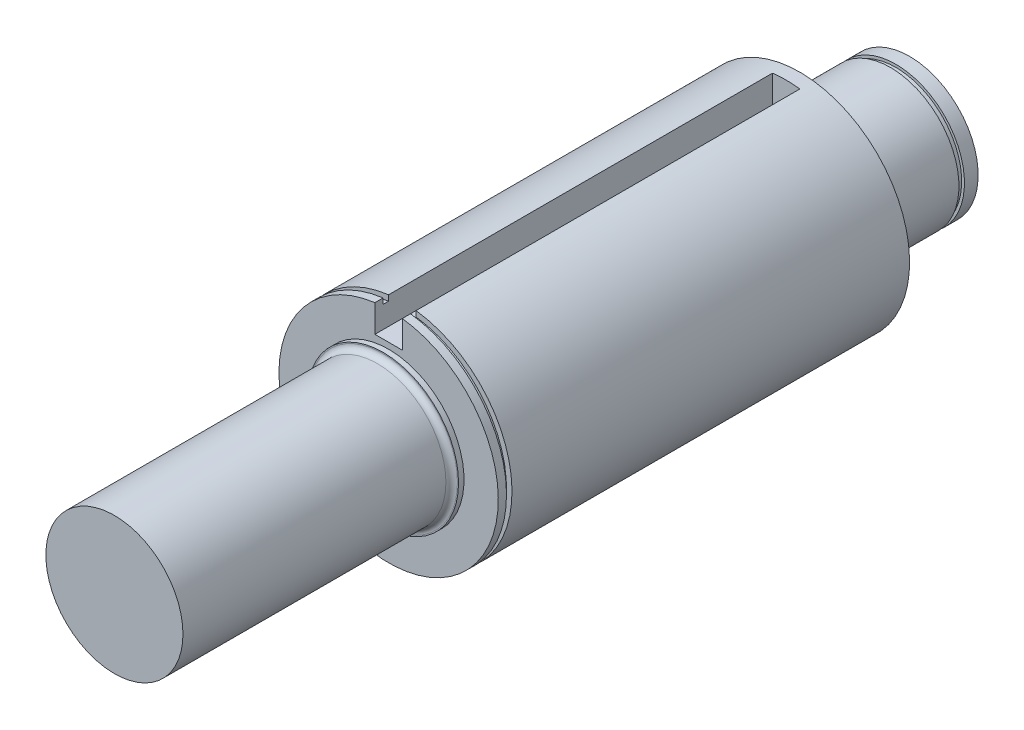
ISO-10303-21;
HEADER;
FILE_DESCRIPTION(('STEP AP214'),'2;1');
FILE_NAME('part.step','',(''),(''),'','','');
FILE_SCHEMA(('AUTOMOTIVE_DESIGN { 1 0 10303 214 1 1 1 1 }'));
ENDSEC;
DATA;
#1=APPLICATION_CONTEXT('core data for automotive mechanical design processes');
#2=APPLICATION_PROTOCOL_DEFINITION('international standard','automotive_design',2000,#1);
#3=PRODUCT_CONTEXT('',#1,'mechanical');
#4=PRODUCT('Part','Part','',(#3));
#5=PRODUCT_RELATED_PRODUCT_CATEGORY('part','',(#4));
#6=PRODUCT_DEFINITION_FORMATION('','',#4);
#7=PRODUCT_DEFINITION_CONTEXT('part definition',#1,'design');
#8=PRODUCT_DEFINITION('design','',#6,#7);
#9=PRODUCT_DEFINITION_SHAPE('','',#8);
#10=(LENGTH_UNIT() NAMED_UNIT(*) SI_UNIT(.MILLI.,.METRE.));
#11=(NAMED_UNIT(*) PLANE_ANGLE_UNIT() SI_UNIT($,.RADIAN.));
#12=(NAMED_UNIT(*) SI_UNIT($,.STERADIAN.) SOLID_ANGLE_UNIT());
#13=UNCERTAINTY_MEASURE_WITH_UNIT(LENGTH_MEASURE(1.E-05),#10,'distance_accuracy_value','');
#14=(GEOMETRIC_REPRESENTATION_CONTEXT(3) GLOBAL_UNCERTAINTY_ASSIGNED_CONTEXT((#13)) GLOBAL_UNIT_ASSIGNED_CONTEXT((#10,
#11,#12)) REPRESENTATION_CONTEXT('',''));
#15=CARTESIAN_POINT('',(0.,0.,0.));
#16=DIRECTION('',(0.,0.,1.));
#17=DIRECTION('',(1.,0.,0.));
#18=AXIS2_PLACEMENT_3D('',#15,#16,#17);
#19=CARTESIAN_POINT('',(0.,0.,-250.));
#20=DIRECTION('',(0.,0.,1.));
#21=DIRECTION('',(1.,0.,0.));
#22=AXIS2_PLACEMENT_3D('',#19,#20,#21);
#23=CYLINDRICAL_SURFACE('',#22,40.);
#24=CARTESIAN_POINT('',(0.,0.,-250.));
#25=DIRECTION('',(0.,0.,-1.));
#26=DIRECTION('',(-1.,0.,0.));
#27=AXIS2_PLACEMENT_3D('',#24,#25,#26);
#28=CIRCLE('',#27,40.);
#29=CARTESIAN_POINT('',(-40.,0.,-250.));
#30=VERTEX_POINT('',#29);
#31=EDGE_CURVE('E124',#30,#30,#28,.T.);
#32=ORIENTED_EDGE('',*,*,#31,.F.);
#33=EDGE_LOOP('',(#32));
#34=FACE_BOUND('',#33,.T.);
#35=CARTESIAN_POINT('',(0.,0.,-105.));
#36=DIRECTION('',(0.,0.,1.));
#37=DIRECTION('',(1.,0.,0.));
#38=AXIS2_PLACEMENT_3D('',#35,#36,#37);
#39=CIRCLE('',#38,40.);
#40=CARTESIAN_POINT('',(-5.,39.6862696659689,-105.));
#41=VERTEX_POINT('',#40);
#42=CARTESIAN_POINT('',(5.,39.6862696659689,-105.));
#43=VERTEX_POINT('',#42);
#44=EDGE_CURVE('E99',#41,#43,#39,.T.);
#45=ORIENTED_EDGE('',*,*,#44,.F.);
#46=DIRECTION('',(0.,0.,1.));
#47=VECTOR('',#46,1.);
#48=CARTESIAN_POINT('',(-5.,39.6862696659689,-250.));
#49=LINE('',#48,#47);
#50=CARTESIAN_POINT('',(-5.,39.6862696659689,-245.));
#51=VERTEX_POINT('',#50);
#52=EDGE_CURVE('E131',#51,#41,#49,.T.);
#53=ORIENTED_EDGE('',*,*,#52,.F.);
#54=CARTESIAN_POINT('',(0.,0.,-245.));
#55=DIRECTION('',(0.,0.,-1.));
#56=DIRECTION('',(-1.,0.,0.));
#57=AXIS2_PLACEMENT_3D('',#54,#55,#56);
#58=CIRCLE('',#57,40.);
#59=CARTESIAN_POINT('',(5.,39.6862696659689,-245.));
#60=VERTEX_POINT('',#59);
#61=EDGE_CURVE('E119',#60,#51,#58,.F.);
#62=ORIENTED_EDGE('',*,*,#61,.F.);
#63=DIRECTION('',(0.,0.,1.));
#64=VECTOR('',#63,1.);
#65=CARTESIAN_POINT('',(5.,39.6862696659689,-250.));
#66=LINE('',#65,#64);
#67=EDGE_CURVE('E114',#60,#43,#66,.T.);
#68=ORIENTED_EDGE('',*,*,#67,.T.);
#69=EDGE_LOOP('',(#45,#53,#62,#68));
#70=FACE_BOUND('',#69,.T.);
#71=ADVANCED_FACE('F34',(#34,#70),#23,.T.);
#72=CARTESIAN_POINT('',(-5.,29.6862696659689,-250.));
#73=DIRECTION('',(-1.,0.,0.));
#74=DIRECTION('',(0.,0.,1.));
#75=AXIS2_PLACEMENT_3D('',#72,#73,#74);
#76=PLANE('',#75);
#77=DIRECTION('',(0.,0.,-1.));
#78=VECTOR('',#77,1.);
#79=CARTESIAN_POINT('',(-5.,37.6696164036747,-103.));
#80=LINE('',#79,#78);
#81=CARTESIAN_POINT('',(-5.,37.6696164036747,-105.));
#82=VERTEX_POINT('',#81);
#83=CARTESIAN_POINT('',(-5.,37.6696164036747,-103.));
#84=VERTEX_POINT('',#83);
#85=EDGE_CURVE('E186',#82,#84,#80,.F.);
#86=ORIENTED_EDGE('',*,*,#85,.T.);
#87=DIRECTION('',(0.,1.,0.));
#88=VECTOR('',#87,1.);
#89=CARTESIAN_POINT('',(-5.,29.6862696659689,-103.));
#90=LINE('',#89,#88);
#91=CARTESIAN_POINT('',(-5.,39.6862696659689,-103.));
#92=VERTEX_POINT('',#91);
#93=EDGE_CURVE('E185',#84,#92,#90,.T.);
#94=ORIENTED_EDGE('',*,*,#93,.T.);
#95=CARTESIAN_POINT('',(-5.,39.6862696659689,-100.));
#96=VERTEX_POINT('',#95);
#97=EDGE_CURVE('E130',#92,#96,#49,.T.);
#98=ORIENTED_EDGE('',*,*,#97,.T.);
#99=DIRECTION('',(0.,-1.,0.));
#100=VECTOR('',#99,1.);
#101=CARTESIAN_POINT('',(-5.,29.6862696659689,-100.));
#102=LINE('',#101,#100);
#103=CARTESIAN_POINT('',(-5.,29.6862696659689,-100.));
#104=VERTEX_POINT('',#103);
#105=EDGE_CURVE('E168',#96,#104,#102,.T.);
#106=ORIENTED_EDGE('',*,*,#105,.T.);
#107=DIRECTION('',(0.,0.,1.));
#108=VECTOR('',#107,1.);
#109=CARTESIAN_POINT('',(-5.,29.6862696659689,-250.));
#110=LINE('',#109,#108);
#111=CARTESIAN_POINT('',(-5.,29.6862696659689,-245.));
#112=VERTEX_POINT('',#111);
#113=EDGE_CURVE('E122',#112,#104,#110,.T.);
#114=ORIENTED_EDGE('',*,*,#113,.F.);
#115=DIRECTION('',(0.,-1.,0.));
#116=VECTOR('',#115,1.);
#117=CARTESIAN_POINT('',(-5.,0.,-245.));
#118=LINE('',#117,#116);
#119=EDGE_CURVE('E198',#51,#112,#118,.T.);
#120=ORIENTED_EDGE('',*,*,#119,.F.);
#121=ORIENTED_EDGE('',*,*,#52,.T.);
#122=DIRECTION('',(0.,1.,0.));
#123=VECTOR('',#122,1.);
#124=CARTESIAN_POINT('',(-5.,29.6862696659689,-105.));
#125=LINE('',#124,#123);
#126=EDGE_CURVE('E49',#82,#41,#125,.T.);
#127=ORIENTED_EDGE('',*,*,#126,.F.);
#128=EDGE_LOOP('',(#86,#94,#98,#106,#114,#120,#121,#127));
#129=FACE_BOUND('',#128,.T.);
#130=ADVANCED_FACE('F184',(#129),#76,.F.);
#131=CARTESIAN_POINT('',(5.,29.6862696659689,-250.));
#132=DIRECTION('',(0.,-1.,0.));
#133=DIRECTION('',(0.,0.,-1.));
#134=AXIS2_PLACEMENT_3D('',#131,#132,#133);
#135=PLANE('',#134);
#136=DIRECTION('',(1.,0.,0.));
#137=VECTOR('',#136,1.);
#138=CARTESIAN_POINT('',(0.,29.6862696659689,-245.));
#139=LINE('',#138,#137);
#140=CARTESIAN_POINT('',(5.,29.6862696659689,-245.));
#141=VERTEX_POINT('',#140);
#142=EDGE_CURVE('E180',#112,#141,#139,.T.);
#143=ORIENTED_EDGE('',*,*,#142,.F.);
#144=ORIENTED_EDGE('',*,*,#113,.T.);
#145=DIRECTION('',(1.,0.,0.));
#146=VECTOR('',#145,1.);
#147=CARTESIAN_POINT('',(5.,29.6862696659689,-100.));
#148=LINE('',#147,#146);
#149=CARTESIAN_POINT('',(5.,29.6862696659689,-100.));
#150=VERTEX_POINT('',#149);
#151=EDGE_CURVE('E163',#104,#150,#148,.T.);
#152=ORIENTED_EDGE('',*,*,#151,.T.);
#153=DIRECTION('',(0.,0.,1.));
#154=VECTOR('',#153,1.);
#155=CARTESIAN_POINT('',(5.,29.6862696659689,-250.));
#156=LINE('',#155,#154);
#157=EDGE_CURVE('E120',#141,#150,#156,.T.);
#158=ORIENTED_EDGE('',*,*,#157,.F.);
#159=EDGE_LOOP('',(#143,#144,#152,#158));
#160=FACE_BOUND('',#159,.T.);
#161=ADVANCED_FACE('F178',(#160),#135,.F.);
#162=CARTESIAN_POINT('',(5.,39.6862696659689,-250.));
#163=DIRECTION('',(1.,0.,0.));
#164=DIRECTION('',(0.,0.,-1.));
#165=AXIS2_PLACEMENT_3D('',#162,#163,#164);
#166=PLANE('',#165);
#167=CARTESIAN_POINT('',(5.,39.6862696659689,-103.));
#168=VERTEX_POINT('',#167);
#169=CARTESIAN_POINT('',(5.,39.6862696659689,-100.));
#170=VERTEX_POINT('',#169);
#171=EDGE_CURVE('E57',#168,#170,#66,.T.);
#172=ORIENTED_EDGE('',*,*,#171,.F.);
#173=DIRECTION('',(0.,-1.,0.));
#174=VECTOR('',#173,1.);
#175=CARTESIAN_POINT('',(5.,39.6862696659689,-103.));
#176=LINE('',#175,#174);
#177=CARTESIAN_POINT('',(5.,37.6696164036747,-103.));
#178=VERTEX_POINT('',#177);
#179=EDGE_CURVE('E156',#168,#178,#176,.T.);
#180=ORIENTED_EDGE('',*,*,#179,.T.);
#181=DIRECTION('',(0.,0.,-1.));
#182=VECTOR('',#181,1.);
#183=CARTESIAN_POINT('',(5.,37.6696164036747,-103.));
#184=LINE('',#183,#182);
#185=CARTESIAN_POINT('',(5.,37.6696164036747,-105.));
#186=VERTEX_POINT('',#185);
#187=EDGE_CURVE('E11',#178,#186,#184,.T.);
#188=ORIENTED_EDGE('',*,*,#187,.T.);
#189=DIRECTION('',(0.,-1.,0.));
#190=VECTOR('',#189,1.);
#191=CARTESIAN_POINT('',(5.,39.6862696659689,-105.));
#192=LINE('',#191,#190);
#193=EDGE_CURVE('E102',#43,#186,#192,.T.);
#194=ORIENTED_EDGE('',*,*,#193,.F.);
#195=ORIENTED_EDGE('',*,*,#67,.F.);
#196=DIRECTION('',(0.,1.,0.));
#197=VECTOR('',#196,1.);
#198=CARTESIAN_POINT('',(5.,0.,-245.));
#199=LINE('',#198,#197);
#200=EDGE_CURVE('E195',#141,#60,#199,.T.);
#201=ORIENTED_EDGE('',*,*,#200,.F.);
#202=ORIENTED_EDGE('',*,*,#157,.T.);
#203=DIRECTION('',(0.,1.,0.));
#204=VECTOR('',#203,1.);
#205=CARTESIAN_POINT('',(5.,39.6862696659689,-100.));
#206=LINE('',#205,#204);
#207=EDGE_CURVE('E126',#150,#170,#206,.T.);
#208=ORIENTED_EDGE('',*,*,#207,.T.);
#209=EDGE_LOOP('',(#172,#180,#188,#194,#195,#201,#202,#208));
#210=FACE_BOUND('',#209,.T.);
#211=ADVANCED_FACE('F112',(#210),#166,.F.);
#212=CARTESIAN_POINT('',(0.,0.,-290.));
#213=DIRECTION('',(0.,0.,1.));
#214=DIRECTION('',(1.,0.,0.));
#215=AXIS2_PLACEMENT_3D('',#212,#213,#214);
#216=CYLINDRICAL_SURFACE('',#215,25.);
#217=CARTESIAN_POINT('',(0.,0.,-254.1));
#218=DIRECTION('',(0.,0.,-1.));
#219=DIRECTION('',(-1.,0.,0.));
#220=AXIS2_PLACEMENT_3D('',#217,#218,#219);
#221=CIRCLE('',#220,25.);
#222=CARTESIAN_POINT('',(-25.,0.,-254.1));
#223=VERTEX_POINT('',#222);
#224=EDGE_CURVE('E148',#223,#223,#221,.T.);
#225=ORIENTED_EDGE('',*,*,#224,.T.);
#226=EDGE_LOOP('',(#225));
#227=FACE_BOUND('',#226,.T.);
#228=CARTESIAN_POINT('',(0.,0.,-283.));
#229=DIRECTION('',(0.,0.,-1.));
#230=DIRECTION('',(-1.,0.,0.));
#231=AXIS2_PLACEMENT_3D('',#228,#229,#230);
#232=CIRCLE('',#231,25.);
#233=CARTESIAN_POINT('',(-25.,0.,-283.));
#234=VERTEX_POINT('',#233);
#235=EDGE_CURVE('E204',#234,#234,#232,.T.);
#236=ORIENTED_EDGE('',*,*,#235,.F.);
#237=EDGE_LOOP('',(#236));
#238=FACE_BOUND('',#237,.T.);
#239=ADVANCED_FACE('F245',(#227,#238),#216,.T.);
#240=ORIENTED_EDGE('',*,*,#97,.F.);
#241=CARTESIAN_POINT('',(0.,0.,-103.));
#242=DIRECTION('',(0.,0.,1.));
#243=DIRECTION('',(1.,0.,0.));
#244=AXIS2_PLACEMENT_3D('',#241,#242,#243);
#245=CIRCLE('',#244,40.);
#246=EDGE_CURVE('E42',#92,#168,#245,.T.);
#247=ORIENTED_EDGE('',*,*,#246,.T.);
#248=ORIENTED_EDGE('',*,*,#171,.T.);
#249=CARTESIAN_POINT('',(0.,0.,-100.));
#250=DIRECTION('',(0.,0.,-1.));
#251=DIRECTION('',(-1.,0.,0.));
#252=AXIS2_PLACEMENT_3D('',#249,#250,#251);
#253=CIRCLE('',#252,40.);
#254=EDGE_CURVE('E165',#170,#96,#253,.T.);
#255=ORIENTED_EDGE('',*,*,#254,.T.);
#256=EDGE_LOOP('',(#240,#247,#248,#255));
#257=FACE_BOUND('',#256,.T.);
#258=ADVANCED_FACE('F153',(#257),#23,.T.);
#259=CARTESIAN_POINT('',(0.,0.,-250.));
#260=DIRECTION('',(0.,0.,-1.));
#261=DIRECTION('',(-1.,0.,0.));
#262=AXIS2_PLACEMENT_3D('',#259,#260,#261);
#263=PLANE('',#262);
#264=CARTESIAN_POINT('',(0.,0.,-250.));
#265=DIRECTION('',(0.,0.,-1.));
#266=DIRECTION('',(-1.,0.,0.));
#267=AXIS2_PLACEMENT_3D('',#264,#265,#266);
#268=CIRCLE('',#267,27.5);
#269=CARTESIAN_POINT('',(-27.5,0.,-250.));
#270=VERTEX_POINT('',#269);
#271=EDGE_CURVE('E145',#270,#270,#268,.T.);
#272=ORIENTED_EDGE('',*,*,#271,.F.);
#273=EDGE_LOOP('',(#272));
#274=FACE_BOUND('',#273,.T.);
#275=ORIENTED_EDGE('',*,*,#31,.T.);
#276=EDGE_LOOP('',(#275));
#277=FACE_BOUND('',#276,.T.);
#278=ADVANCED_FACE('F227',(#274,#277),#263,.T.);
#279=CARTESIAN_POINT('',(0.,0.,-100.));
#280=DIRECTION('',(0.,0.,-1.));
#281=DIRECTION('',(-1.,0.,0.));
#282=AXIS2_PLACEMENT_3D('',#279,#280,#281);
#283=PLANE('',#282);
#284=CARTESIAN_POINT('',(0.,0.,-100.));
#285=DIRECTION('',(0.,0.,-1.));
#286=DIRECTION('',(-1.,0.,0.));
#287=AXIS2_PLACEMENT_3D('',#284,#285,#286);
#288=CIRCLE('',#287,27.5);
#289=CARTESIAN_POINT('',(-27.5,0.,-100.));
#290=VERTEX_POINT('',#289);
#291=EDGE_CURVE('E136',#290,#290,#288,.F.);
#292=ORIENTED_EDGE('',*,*,#291,.F.);
#293=EDGE_LOOP('',(#292));
#294=FACE_BOUND('',#293,.T.);
#295=ORIENTED_EDGE('',*,*,#254,.F.);
#296=ORIENTED_EDGE('',*,*,#207,.F.);
#297=ORIENTED_EDGE('',*,*,#151,.F.);
#298=ORIENTED_EDGE('',*,*,#105,.F.);
#299=EDGE_LOOP('',(#295,#296,#297,#298));
#300=FACE_BOUND('',#299,.T.);
#301=ADVANCED_FACE('F166',(#294,#300),#283,.F.);
#302=CARTESIAN_POINT('',(0.,0.,-98.));
#303=DIRECTION('',(0.,0.,-1.));
#304=DIRECTION('',(-1.,0.,0.));
#305=AXIS2_PLACEMENT_3D('',#302,#303,#304);
#306=CYLINDRICAL_SURFACE('',#305,27.5);
#307=CARTESIAN_POINT('',(0.,0.,-98.));
#308=DIRECTION('',(0.,0.,1.));
#309=DIRECTION('',(1.,0.,0.));
#310=AXIS2_PLACEMENT_3D('',#307,#308,#309);
#311=CIRCLE('',#310,27.5);
#312=CARTESIAN_POINT('',(27.5,0.,-98.));
#313=VERTEX_POINT('',#312);
#314=EDGE_CURVE('E173',#313,#313,#311,.T.);
#315=ORIENTED_EDGE('',*,*,#314,.F.);
#316=EDGE_LOOP('',(#315));
#317=FACE_BOUND('',#316,.T.);
#318=ORIENTED_EDGE('',*,*,#291,.T.);
#319=EDGE_LOOP('',(#318));
#320=FACE_BOUND('',#319,.T.);
#321=ADVANCED_FACE('F220',(#317,#320),#306,.T.);
#322=CARTESIAN_POINT('',(0.,0.,-98.));
#323=DIRECTION('',(0.,0.,1.));
#324=DIRECTION('',(1.,0.,0.));
#325=AXIS2_PLACEMENT_3D('',#322,#323,#324);
#326=PLANE('',#325);
#327=CARTESIAN_POINT('',(0.,0.,-98.));
#328=DIRECTION('',(0.,0.,1.));
#329=DIRECTION('',(1.,0.,0.));
#330=AXIS2_PLACEMENT_3D('',#327,#328,#329);
#331=CIRCLE('',#330,27.1);
#332=CARTESIAN_POINT('',(27.1,0.,-98.));
#333=VERTEX_POINT('',#332);
#334=EDGE_CURVE('E139',#333,#333,#331,.F.);
#335=ORIENTED_EDGE('',*,*,#334,.T.);
#336=EDGE_LOOP('',(#335));
#337=FACE_BOUND('',#336,.T.);
#338=ORIENTED_EDGE('',*,*,#314,.T.);
#339=EDGE_LOOP('',(#338));
#340=FACE_BOUND('',#339,.T.);
#341=ADVANCED_FACE('F218',(#337,#340),#326,.T.);
#342=CARTESIAN_POINT('',(0.,0.,0.));
#343=DIRECTION('',(0.,0.,1.));
#344=DIRECTION('',(1.,0.,0.));
#345=AXIS2_PLACEMENT_3D('',#342,#343,#344);
#346=PLANE('',#345);
#347=CARTESIAN_POINT('',(0.,0.,0.));
#348=DIRECTION('',(0.,0.,1.));
#349=DIRECTION('',(1.,0.,0.));
#350=AXIS2_PLACEMENT_3D('',#347,#348,#349);
#351=CIRCLE('',#350,25.);
#352=CARTESIAN_POINT('',(25.,0.,0.));
#353=VERTEX_POINT('',#352);
#354=EDGE_CURVE('E133',#353,#353,#351,.T.);
#355=ORIENTED_EDGE('',*,*,#354,.T.);
#356=EDGE_LOOP('',(#355));
#357=FACE_BOUND('',#356,.T.);
#358=ADVANCED_FACE('F302',(#357),#346,.T.);
#359=CARTESIAN_POINT('',(0.,0.,-100.));
#360=DIRECTION('',(0.,0.,1.));
#361=DIRECTION('',(1.,0.,0.));
#362=AXIS2_PLACEMENT_3D('',#359,#360,#361);
#363=CYLINDRICAL_SURFACE('',#362,25.);
#364=CARTESIAN_POINT('',(0.,0.,-95.9));
#365=DIRECTION('',(0.,0.,1.));
#366=DIRECTION('',(1.,0.,0.));
#367=AXIS2_PLACEMENT_3D('',#364,#365,#366);
#368=CIRCLE('',#367,25.);
#369=CARTESIAN_POINT('',(25.,0.,-95.9));
#370=VERTEX_POINT('',#369);
#371=EDGE_CURVE('E142',#370,#370,#368,.T.);
#372=CARTESIAN_POINT('',(25.,0.,-95.9));
#373=CARTESIAN_POINT('',(25.,0.,-94.9010416666667));
#374=CARTESIAN_POINT('',(25.,0.,-93.9020833333333));
#375=CARTESIAN_POINT('',(25.,0.,-91.9041666666667));
#376=CARTESIAN_POINT('',(25.,0.,-90.9052083333333));
#377=CARTESIAN_POINT('',(25.,0.,-88.9072916666667));
#378=CARTESIAN_POINT('',(25.,0.,-87.9083333333333));
#379=CARTESIAN_POINT('',(25.,0.,-85.9104166666667));
#380=CARTESIAN_POINT('',(25.,0.,-84.9114583333333));
#381=CARTESIAN_POINT('',(25.,0.,-82.9135416666667));
#382=CARTESIAN_POINT('',(25.,0.,-81.9145833333333));
#383=CARTESIAN_POINT('',(25.,0.,-79.9166666666667));
#384=CARTESIAN_POINT('',(25.,0.,-78.9177083333333));
#385=CARTESIAN_POINT('',(25.,0.,-76.9197916666667));
#386=CARTESIAN_POINT('',(25.,0.,-75.9208333333333));
#387=CARTESIAN_POINT('',(25.,0.,-73.9229166666667));
#388=CARTESIAN_POINT('',(25.,0.,-72.9239583333333));
#389=CARTESIAN_POINT('',(25.,0.,-70.9260416666667));
#390=CARTESIAN_POINT('',(25.,0.,-69.9270833333333));
#391=CARTESIAN_POINT('',(25.,0.,-67.9291666666667));
#392=CARTESIAN_POINT('',(25.,0.,-66.9302083333333));
#393=CARTESIAN_POINT('',(25.,0.,-64.9322916666667));
#394=CARTESIAN_POINT('',(25.,0.,-63.9333333333333));
#395=CARTESIAN_POINT('',(25.,0.,-61.9354166666667));
#396=CARTESIAN_POINT('',(25.,0.,-60.9364583333333));
#397=CARTESIAN_POINT('',(25.,0.,-58.9385416666667));
#398=CARTESIAN_POINT('',(25.,0.,-57.9395833333333));
#399=CARTESIAN_POINT('',(25.,0.,-55.9416666666667));
#400=CARTESIAN_POINT('',(25.,0.,-54.9427083333333));
#401=CARTESIAN_POINT('',(25.,0.,-52.9447916666667));
#402=CARTESIAN_POINT('',(25.,0.,-51.9458333333333));
#403=CARTESIAN_POINT('',(25.,0.,-49.9479166666667));
#404=CARTESIAN_POINT('',(25.,0.,-48.9489583333333));
#405=CARTESIAN_POINT('',(25.,0.,-46.9510416666667));
#406=CARTESIAN_POINT('',(25.,0.,-45.9520833333333));
#407=CARTESIAN_POINT('',(25.,0.,-43.9541666666667));
#408=CARTESIAN_POINT('',(25.,0.,-42.9552083333333));
#409=CARTESIAN_POINT('',(25.,0.,-40.9572916666667));
#410=CARTESIAN_POINT('',(25.,0.,-39.9583333333333));
#411=CARTESIAN_POINT('',(25.,0.,-37.9604166666667));
#412=CARTESIAN_POINT('',(25.,0.,-36.9614583333333));
#413=CARTESIAN_POINT('',(25.,0.,-34.9635416666667));
#414=CARTESIAN_POINT('',(25.,0.,-33.9645833333333));
#415=CARTESIAN_POINT('',(25.,0.,-31.9666666666667));
#416=CARTESIAN_POINT('',(25.,0.,-30.9677083333333));
#417=CARTESIAN_POINT('',(25.,0.,-28.9697916666667));
#418=CARTESIAN_POINT('',(25.,0.,-27.9708333333333));
#419=CARTESIAN_POINT('',(25.,0.,-25.9729166666667));
#420=CARTESIAN_POINT('',(25.,0.,-24.9739583333333));
#421=CARTESIAN_POINT('',(25.,0.,-22.9760416666667));
#422=CARTESIAN_POINT('',(25.,0.,-21.9770833333333));
#423=CARTESIAN_POINT('',(25.,0.,-19.9791666666667));
#424=CARTESIAN_POINT('',(25.,0.,-18.9802083333333));
#425=CARTESIAN_POINT('',(25.,0.,-16.9822916666667));
#426=CARTESIAN_POINT('',(25.,0.,-15.9833333333333));
#427=CARTESIAN_POINT('',(25.,0.,-13.9854166666667));
#428=CARTESIAN_POINT('',(25.,0.,-12.9864583333333));
#429=CARTESIAN_POINT('',(25.,0.,-10.9885416666667));
#430=CARTESIAN_POINT('',(25.,0.,-9.98958333333333));
#431=CARTESIAN_POINT('',(25.,0.,-7.99166666666667));
#432=CARTESIAN_POINT('',(25.,0.,-6.99270833333333));
#433=CARTESIAN_POINT('',(25.,0.,-4.99479166666666));
#434=CARTESIAN_POINT('',(25.,0.,-3.99583333333332));
#435=CARTESIAN_POINT('',(25.,0.,-1.99791666666665));
#436=CARTESIAN_POINT('',(25.,0.,-0.998958333333328));
#437=CARTESIAN_POINT('',(25.,0.,0.));
#438=B_SPLINE_CURVE_WITH_KNOTS('',3,(#372,#373,#374,#375,#376,#377,#378,#379,#380,#381,#382,
#383,#384,#385,#386,#387,#388,#389,#390,#391,#392,#393,#394,#395,#396,#397,#398,#399,#400,#401,
#402,#403,#404,#405,#406,#407,#408,#409,#410,#411,#412,#413,#414,#415,#416,#417,#418,#419,#420,
#421,#422,#423,#424,#425,#426,#427,#428,#429,#430,#431,#432,#433,#434,#435,#436,#437),
.UNSPECIFIED.,.F.,.F.,(4,2,2,2,2,2,2,2,2,2,2,2,2,2,2,2,2,2,2,2,2,2,2,2,2,2,2,2,2,2,2,2,4),(0.,
2.99687500000001,5.99375000000001,8.990625,11.9875,14.984375,17.98125,20.978125,23.975,
26.971875,29.96875,32.965625,35.9625,38.959375,41.95625,44.953125,47.95,50.946875,53.94375,
56.940625,59.9375,62.934375,65.93125,68.928125,71.925,74.921875,77.91875,80.915625,83.9125,
86.909375,89.90625,92.903125,95.9),.UNSPECIFIED.);
#439=EDGE_CURVE('BSEAM307',#370,#353,#438,.T.);
#440=ORIENTED_EDGE('',*,*,#371,.T.);
#441=ORIENTED_EDGE('',*,*,#354,.F.);
#442=ORIENTED_EDGE('',*,*,#439,.T.);
#443=ORIENTED_EDGE('',*,*,#439,.F.);
#444=EDGE_LOOP('',(#440,#442,#441,#443));
#445=FACE_BOUND('',#444,.T.);
#446=ADVANCED_FACE('F307',(#445),#363,.T.);
#447=CARTESIAN_POINT('',(0.,0.,-95.9));
#448=DIRECTION('',(0.,0.,1.));
#449=DIRECTION('',(1.,0.,0.));
#450=AXIS2_PLACEMENT_3D('',#447,#448,#449);
#451=TOROIDAL_SURFACE('',#450,27.1,2.1);
#452=ORIENTED_EDGE('',*,*,#371,.F.);
#453=EDGE_LOOP('',(#452));
#454=FACE_BOUND('',#453,.T.);
#455=ORIENTED_EDGE('',*,*,#334,.F.);
#456=EDGE_LOOP('',(#455));
#457=FACE_BOUND('',#456,.T.);
#458=ADVANCED_FACE('F299',(#454,#457),#451,.F.);
#459=CARTESIAN_POINT('',(0.,0.,-252.));
#460=DIRECTION('',(0.,0.,1.));
#461=DIRECTION('',(1.,0.,0.));
#462=AXIS2_PLACEMENT_3D('',#459,#460,#461);
#463=CYLINDRICAL_SURFACE('',#462,27.5);
#464=CARTESIAN_POINT('',(0.,0.,-252.));
#465=DIRECTION('',(0.,0.,1.));
#466=DIRECTION('',(1.,0.,0.));
#467=AXIS2_PLACEMENT_3D('',#464,#465,#466);
#468=CIRCLE('',#467,27.5);
#469=CARTESIAN_POINT('',(27.5,0.,-252.));
#470=VERTEX_POINT('',#469);
#471=EDGE_CURVE('E210',#470,#470,#468,.T.);
#472=ORIENTED_EDGE('',*,*,#471,.T.);
#473=EDGE_LOOP('',(#472));
#474=FACE_BOUND('',#473,.T.);
#475=ORIENTED_EDGE('',*,*,#271,.T.);
#476=EDGE_LOOP('',(#475));
#477=FACE_BOUND('',#476,.T.);
#478=ADVANCED_FACE('F295',(#474,#477),#463,.T.);
#479=CARTESIAN_POINT('',(0.,0.,-252.));
#480=DIRECTION('',(0.,0.,-1.));
#481=DIRECTION('',(1.,0.,0.));
#482=AXIS2_PLACEMENT_3D('',#479,#480,#481);
#483=PLANE('',#482);
#484=CARTESIAN_POINT('',(0.,0.,-252.));
#485=DIRECTION('',(0.,0.,-1.));
#486=DIRECTION('',(-1.,0.,0.));
#487=AXIS2_PLACEMENT_3D('',#484,#485,#486);
#488=CIRCLE('',#487,27.1);
#489=CARTESIAN_POINT('',(-27.1,0.,-252.));
#490=VERTEX_POINT('',#489);
#491=EDGE_CURVE('E108',#490,#490,#488,.F.);
#492=ORIENTED_EDGE('',*,*,#491,.T.);
#493=EDGE_LOOP('',(#492));
#494=FACE_BOUND('',#493,.T.);
#495=ORIENTED_EDGE('',*,*,#471,.F.);
#496=EDGE_LOOP('',(#495));
#497=FACE_BOUND('',#496,.T.);
#498=ADVANCED_FACE('F292',(#494,#497),#483,.T.);
#499=CARTESIAN_POINT('',(0.,0.,-254.1));
#500=DIRECTION('',(0.,0.,-1.));
#501=DIRECTION('',(-1.,0.,0.));
#502=AXIS2_PLACEMENT_3D('',#499,#500,#501);
#503=TOROIDAL_SURFACE('',#502,27.1,2.1);
#504=ORIENTED_EDGE('',*,*,#491,.F.);
#505=EDGE_LOOP('',(#504));
#506=FACE_BOUND('',#505,.T.);
#507=ORIENTED_EDGE('',*,*,#224,.F.);
#508=EDGE_LOOP('',(#507));
#509=FACE_BOUND('',#508,.T.);
#510=ADVANCED_FACE('F36',(#506,#509),#503,.F.);
#511=CARTESIAN_POINT('',(0.,0.,-285.));
#512=DIRECTION('',(0.,0.,-1.));
#513=DIRECTION('',(-1.,0.,0.));
#514=AXIS2_PLACEMENT_3D('',#511,#512,#513);
#515=PLANE('',#514);
#516=CARTESIAN_POINT('',(0.,0.,-285.));
#517=DIRECTION('',(0.,0.,-1.));
#518=DIRECTION('',(-1.,0.,0.));
#519=AXIS2_PLACEMENT_3D('',#516,#517,#518);
#520=CIRCLE('',#519,25.);
#521=CARTESIAN_POINT('',(-25.,0.,-285.));
#522=VERTEX_POINT('',#521);
#523=EDGE_CURVE('E207',#522,#522,#520,.T.);
#524=ORIENTED_EDGE('',*,*,#523,.F.);
#525=EDGE_LOOP('',(#524));
#526=FACE_BOUND('',#525,.T.);
#527=CARTESIAN_POINT('',(0.,0.,-285.));
#528=DIRECTION('',(0.,0.,-1.));
#529=DIRECTION('',(-1.,0.,0.));
#530=AXIS2_PLACEMENT_3D('',#527,#528,#529);
#531=CIRCLE('',#530,24.);
#532=CARTESIAN_POINT('',(-24.,0.,-285.));
#533=VERTEX_POINT('',#532);
#534=EDGE_CURVE('E201',#533,#533,#531,.T.);
#535=ORIENTED_EDGE('',*,*,#534,.T.);
#536=EDGE_LOOP('',(#535));
#537=FACE_BOUND('',#536,.T.);
#538=ADVANCED_FACE('F274',(#526,#537),#515,.F.);
#539=CARTESIAN_POINT('',(0.,0.,-283.));
#540=DIRECTION('',(0.,0.,-1.));
#541=DIRECTION('',(-1.,0.,0.));
#542=AXIS2_PLACEMENT_3D('',#539,#540,#541);
#543=PLANE('',#542);
#544=ORIENTED_EDGE('',*,*,#235,.T.);
#545=EDGE_LOOP('',(#544));
#546=FACE_BOUND('',#545,.T.);
#547=CARTESIAN_POINT('',(0.,0.,-283.));
#548=DIRECTION('',(0.,0.,-1.));
#549=DIRECTION('',(-1.,0.,0.));
#550=AXIS2_PLACEMENT_3D('',#547,#548,#549);
#551=CIRCLE('',#550,24.);
#552=CARTESIAN_POINT('',(-24.,0.,-283.));
#553=VERTEX_POINT('',#552);
#554=EDGE_CURVE('E200',#553,#553,#551,.T.);
#555=ORIENTED_EDGE('',*,*,#554,.F.);
#556=EDGE_LOOP('',(#555));
#557=FACE_BOUND('',#556,.T.);
#558=ADVANCED_FACE('F277',(#546,#557),#543,.T.);
#559=CARTESIAN_POINT('',(0.,0.,-285.));
#560=DIRECTION('',(0.,0.,1.));
#561=DIRECTION('',(1.,0.,0.));
#562=AXIS2_PLACEMENT_3D('',#559,#560,#561);
#563=CYLINDRICAL_SURFACE('',#562,24.);
#564=ORIENTED_EDGE('',*,*,#534,.F.);
#565=EDGE_LOOP('',(#564));
#566=FACE_BOUND('',#565,.T.);
#567=ORIENTED_EDGE('',*,*,#554,.T.);
#568=EDGE_LOOP('',(#567));
#569=FACE_BOUND('',#568,.T.);
#570=ADVANCED_FACE('F268',(#566,#569),#563,.T.);
#571=CARTESIAN_POINT('',(0.,0.,-290.));
#572=DIRECTION('',(0.,0.,-1.));
#573=DIRECTION('',(-1.,0.,0.));
#574=AXIS2_PLACEMENT_3D('',#571,#572,#573);
#575=PLANE('',#574);
#576=CARTESIAN_POINT('',(0.,0.,-290.));
#577=DIRECTION('',(0.,0.,-1.));
#578=DIRECTION('',(-1.,0.,0.));
#579=AXIS2_PLACEMENT_3D('',#576,#577,#578);
#580=CIRCLE('',#579,25.);
#581=CARTESIAN_POINT('',(-25.,0.,-290.));
#582=VERTEX_POINT('',#581);
#583=EDGE_CURVE('E169',#582,#582,#580,.T.);
#584=ORIENTED_EDGE('',*,*,#583,.T.);
#585=EDGE_LOOP('',(#584));
#586=FACE_BOUND('',#585,.T.);
#587=ADVANCED_FACE('F259',(#586),#575,.T.);
#588=ORIENTED_EDGE('',*,*,#523,.T.);
#589=EDGE_LOOP('',(#588));
#590=FACE_BOUND('',#589,.T.);
#591=ORIENTED_EDGE('',*,*,#583,.F.);
#592=EDGE_LOOP('',(#591));
#593=FACE_BOUND('',#592,.T.);
#594=ADVANCED_FACE('F251',(#590,#593),#216,.T.);
#595=CARTESIAN_POINT('',(0.,0.,-245.));
#596=DIRECTION('',(0.,0.,-1.));
#597=DIRECTION('',(-1.,0.,0.));
#598=AXIS2_PLACEMENT_3D('',#595,#596,#597);
#599=PLANE('',#598);
#600=ORIENTED_EDGE('',*,*,#61,.T.);
#601=ORIENTED_EDGE('',*,*,#119,.T.);
#602=ORIENTED_EDGE('',*,*,#142,.T.);
#603=ORIENTED_EDGE('',*,*,#200,.T.);
#604=EDGE_LOOP('',(#600,#601,#602,#603));
#605=FACE_BOUND('',#604,.T.);
#606=ADVANCED_FACE('F258',(#605),#599,.F.);
#607=CARTESIAN_POINT('',(0.,0.,-103.));
#608=DIRECTION('',(0.,0.,-1.));
#609=DIRECTION('',(-1.,0.,0.));
#610=AXIS2_PLACEMENT_3D('',#607,#608,#609);
#611=CYLINDRICAL_SURFACE('',#610,38.);
#612=CARTESIAN_POINT('',(0.,0.,-105.));
#613=DIRECTION('',(0.,0.,1.));
#614=DIRECTION('',(1.,0.,0.));
#615=AXIS2_PLACEMENT_3D('',#612,#613,#614);
#616=CIRCLE('',#615,38.);
#617=EDGE_CURVE('E462',#82,#186,#616,.T.);
#618=ORIENTED_EDGE('',*,*,#617,.T.);
#619=ORIENTED_EDGE('',*,*,#187,.F.);
#620=CARTESIAN_POINT('',(0.,0.,-103.));
#621=DIRECTION('',(0.,0.,1.));
#622=DIRECTION('',(1.,0.,0.));
#623=AXIS2_PLACEMENT_3D('',#620,#621,#622);
#624=CIRCLE('',#623,38.);
#625=EDGE_CURVE('E116',#84,#178,#624,.T.);
#626=ORIENTED_EDGE('',*,*,#625,.F.);
#627=ORIENTED_EDGE('',*,*,#85,.F.);
#628=EDGE_LOOP('',(#618,#619,#626,#627));
#629=FACE_BOUND('',#628,.T.);
#630=ADVANCED_FACE('F265',(#629),#611,.T.);
#631=CARTESIAN_POINT('',(0.,0.,-103.));
#632=DIRECTION('',(0.,0.,1.));
#633=DIRECTION('',(1.,0.,0.));
#634=AXIS2_PLACEMENT_3D('',#631,#632,#633);
#635=PLANE('',#634);
#636=ORIENTED_EDGE('',*,*,#625,.T.);
#637=ORIENTED_EDGE('',*,*,#179,.F.);
#638=ORIENTED_EDGE('',*,*,#246,.F.);
#639=ORIENTED_EDGE('',*,*,#93,.F.);
#640=EDGE_LOOP('',(#636,#637,#638,#639));
#641=FACE_BOUND('',#640,.T.);
#642=ADVANCED_FACE('F441',(#641),#635,.F.);
#643=CARTESIAN_POINT('',(0.,0.,-105.));
#644=DIRECTION('',(0.,0.,1.));
#645=DIRECTION('',(1.,0.,0.));
#646=AXIS2_PLACEMENT_3D('',#643,#644,#645);
#647=PLANE('',#646);
#648=ORIENTED_EDGE('',*,*,#126,.T.);
#649=ORIENTED_EDGE('',*,*,#44,.T.);
#650=ORIENTED_EDGE('',*,*,#193,.T.);
#651=ORIENTED_EDGE('',*,*,#617,.F.);
#652=EDGE_LOOP('',(#648,#649,#650,#651));
#653=FACE_BOUND('',#652,.T.);
#654=ADVANCED_FACE('F101',(#653),#647,.T.);
#655=CLOSED_SHELL('',(#71,#130,#161,#211,#239,#258,#278,#301,#321,#341,#358,#446,#458,#478,#498,
#510,#538,#558,#570,#587,#594,#606,#630,#642,#654));
#656=MANIFOLD_SOLID_BREP('B2',#655);
#657=ADVANCED_BREP_SHAPE_REPRESENTATION('',(#18,#656),#14);
#658=SHAPE_DEFINITION_REPRESENTATION(#9,#657);
ENDSEC;
END-ISO-10303-21;
